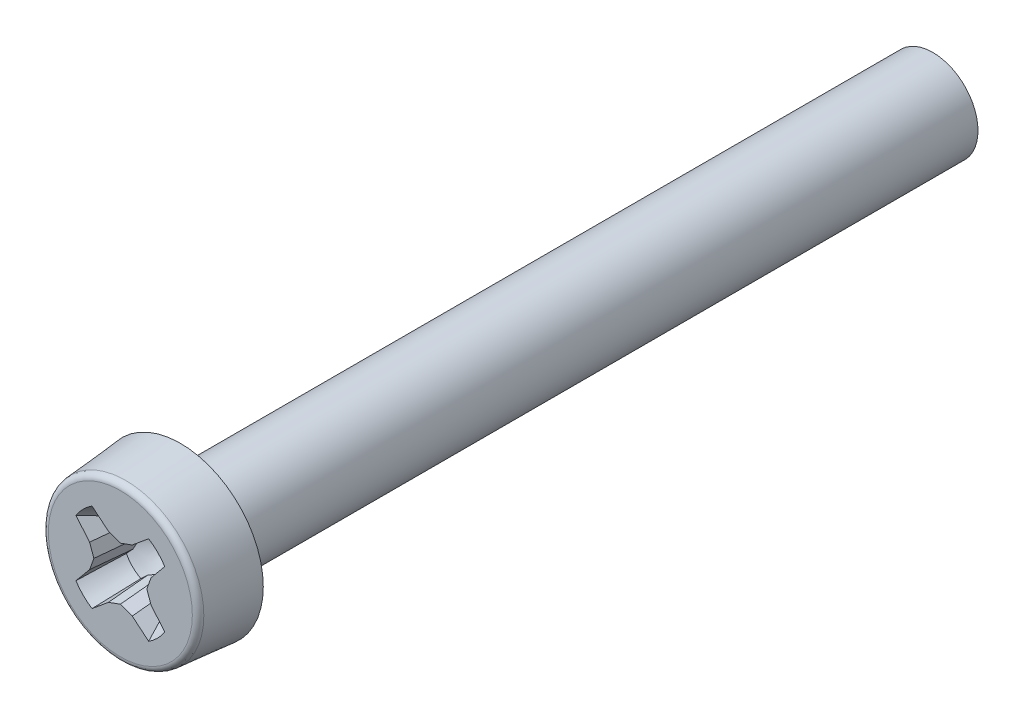
ISO-10303-21;
HEADER;
FILE_DESCRIPTION(('STEP AP214'),'2;1');
FILE_NAME('part.step','',(''),(''),'','','');
FILE_SCHEMA(('AUTOMOTIVE_DESIGN { 1 0 10303 214 1 1 1 1 }'));
ENDSEC;
DATA;
#1=APPLICATION_CONTEXT('core data for automotive mechanical design processes');
#2=APPLICATION_PROTOCOL_DEFINITION('international standard','automotive_design',2000,#1);
#3=PRODUCT_CONTEXT('',#1,'mechanical');
#4=PRODUCT('Part','Part','',(#3));
#5=PRODUCT_RELATED_PRODUCT_CATEGORY('part','',(#4));
#6=PRODUCT_DEFINITION_FORMATION('','',#4);
#7=PRODUCT_DEFINITION_CONTEXT('part definition',#1,'design');
#8=PRODUCT_DEFINITION('design','',#6,#7);
#9=PRODUCT_DEFINITION_SHAPE('','',#8);
#10=(LENGTH_UNIT() NAMED_UNIT(*) SI_UNIT(.MILLI.,.METRE.));
#11=(NAMED_UNIT(*) PLANE_ANGLE_UNIT() SI_UNIT($,.RADIAN.));
#12=(NAMED_UNIT(*) SI_UNIT($,.STERADIAN.) SOLID_ANGLE_UNIT());
#13=UNCERTAINTY_MEASURE_WITH_UNIT(LENGTH_MEASURE(1.E-05),#10,'distance_accuracy_value','');
#14=(GEOMETRIC_REPRESENTATION_CONTEXT(3) GLOBAL_UNCERTAINTY_ASSIGNED_CONTEXT((#13)) GLOBAL_UNIT_ASSIGNED_CONTEXT((#10,
#11,#12)) REPRESENTATION_CONTEXT('',''));
#15=CARTESIAN_POINT('',(0.,0.,0.));
#16=DIRECTION('',(0.,0.,1.));
#17=DIRECTION('',(1.,0.,0.));
#18=AXIS2_PLACEMENT_3D('',#15,#16,#17);
#19=CARTESIAN_POINT('',(0.,0.,-25.));
#20=DIRECTION('',(0.,0.,1.));
#21=DIRECTION('',(1.,0.,0.));
#22=AXIS2_PLACEMENT_3D('',#19,#20,#21);
#23=PLANE('',#22);
#24=CARTESIAN_POINT('',(0.,0.,-25.));
#25=DIRECTION('',(0.,0.,1.));
#26=DIRECTION('',(1.,0.,0.));
#27=AXIS2_PLACEMENT_3D('',#24,#25,#26);
#28=CIRCLE('',#27,1.5);
#29=CARTESIAN_POINT('',(1.5,0.,-25.));
#30=VERTEX_POINT('',#29);
#31=EDGE_CURVE('E11',#30,#30,#28,.T.);
#32=ORIENTED_EDGE('',*,*,#31,.F.);
#33=EDGE_LOOP('',(#32));
#34=FACE_BOUND('',#33,.T.);
#35=ADVANCED_FACE('F16',(#34),#23,.F.);
#36=CARTESIAN_POINT('',(0.,0.,-0.1));
#37=DIRECTION('',(0.,0.,-1.));
#38=DIRECTION('',(1.,0.,0.));
#39=AXIS2_PLACEMENT_3D('',#36,#37,#38);
#40=CYLINDRICAL_SURFACE('',#39,1.5);
#41=DIRECTION('',(0.,0.,-1.));
#42=VECTOR('',#41,1.);
#43=CARTESIAN_POINT('',(1.5,0.,-0.1));
#44=LINE('',#43,#42);
#45=CARTESIAN_POINT('',(1.5,0.,-0.1));
#46=VERTEX_POINT('',#45);
#47=EDGE_CURVE('E29',#46,#30,#44,.T.);
#48=ORIENTED_EDGE('',*,*,#47,.T.);
#49=ORIENTED_EDGE('',*,*,#31,.T.);
#50=ORIENTED_EDGE('',*,*,#47,.F.);
#51=CARTESIAN_POINT('',(0.,0.,-0.1));
#52=DIRECTION('',(0.,0.,1.));
#53=DIRECTION('',(1.,0.,0.));
#54=AXIS2_PLACEMENT_3D('',#51,#52,#53);
#55=CIRCLE('',#54,1.5);
#56=EDGE_CURVE('E468',#46,#46,#55,.T.);
#57=ORIENTED_EDGE('',*,*,#56,.F.);
#58=EDGE_LOOP('',(#48,#49,#50,#57));
#59=FACE_BOUND('',#58,.T.);
#60=ADVANCED_FACE('F568',(#59),#40,.T.);
#61=CARTESIAN_POINT('',(1.6,0.,0.));
#62=CARTESIAN_POINT('',(1.54142135623731,0.,0.));
#63=CARTESIAN_POINT('',(1.5,0.,-0.0414213562373095));
#64=CARTESIAN_POINT('',(1.5,0.,-0.1));
#65=(BOUNDED_CURVE() B_SPLINE_CURVE(3,(#61,#62,#63,#64),.UNSPECIFIED.,.F.,
.F.) B_SPLINE_CURVE_WITH_KNOTS((4,4),(0.,1.),
.UNSPECIFIED.) CURVE() GEOMETRIC_REPRESENTATION_ITEM() RATIONAL_B_SPLINE_CURVE((1.,
0.804737854124365,0.804737854124365,1.)) REPRESENTATION_ITEM(''));
#66=CARTESIAN_POINT('',(0.,0.,0.));
#67=DIRECTION('',(0.,0.,-1.));
#68=AXIS1_PLACEMENT('',#66,#67);
#69=SURFACE_OF_REVOLUTION('',#65,#68);
#70=CARTESIAN_POINT('',(1.6,0.,-0.1));
#71=DIRECTION('',(0.,-1.,0.));
#72=DIRECTION('',(0.,0.,1.));
#73=AXIS2_PLACEMENT_3D('',#70,#71,#72);
#74=CIRCLE('',#73,0.1);
#75=CARTESIAN_POINT('',(1.6,0.,0.));
#76=VERTEX_POINT('',#75);
#77=EDGE_CURVE('E472',#76,#46,#74,.T.);
#78=ORIENTED_EDGE('',*,*,#77,.T.);
#79=ORIENTED_EDGE('',*,*,#56,.T.);
#80=ORIENTED_EDGE('',*,*,#77,.F.);
#81=CARTESIAN_POINT('',(0.,0.,0.));
#82=DIRECTION('',(0.,0.,1.));
#83=DIRECTION('',(1.,0.,0.));
#84=AXIS2_PLACEMENT_3D('',#81,#82,#83);
#85=CIRCLE('',#84,1.6);
#86=EDGE_CURVE('E838',#76,#76,#85,.T.);
#87=ORIENTED_EDGE('',*,*,#86,.F.);
#88=EDGE_LOOP('',(#78,#79,#80,#87));
#89=FACE_BOUND('',#88,.T.);
#90=ADVANCED_FACE('F564',(#89),#69,.T.);
#91=CARTESIAN_POINT('',(0.,0.,0.));
#92=DIRECTION('',(0.,0.,1.));
#93=DIRECTION('',(1.,0.,0.));
#94=AXIS2_PLACEMENT_3D('',#91,#92,#93);
#95=PLANE('',#94);
#96=ORIENTED_EDGE('',*,*,#86,.T.);
#97=EDGE_LOOP('',(#96));
#98=FACE_BOUND('',#97,.T.);
#99=CARTESIAN_POINT('',(0.,0.,0.));
#100=DIRECTION('',(0.,0.,1.));
#101=DIRECTION('',(1.,0.,0.));
#102=AXIS2_PLACEMENT_3D('',#99,#100,#101);
#103=CIRCLE('',#102,2.75);
#104=CARTESIAN_POINT('',(2.75,0.,0.));
#105=VERTEX_POINT('',#104);
#106=EDGE_CURVE('E413',#105,#105,#103,.T.);
#107=ORIENTED_EDGE('',*,*,#106,.F.);
#108=EDGE_LOOP('',(#107));
#109=FACE_BOUND('',#108,.T.);
#110=ADVANCED_FACE('F567',(#98,#109),#95,.F.);
#111=CARTESIAN_POINT('',(0.,0.,1.81743114855));
#112=DIRECTION('',(0.,0.,-1.));
#113=DIRECTION('',(1.,0.,0.));
#114=AXIS2_PLACEMENT_3D('',#111,#112,#113);
#115=CONICAL_SURFACE('',#114,2.591759345272,0.08684928479054);
#116=DIRECTION('',(0.0867401448538781,0.,-0.996230970844978));
#117=VECTOR('',#116,1.);
#118=CARTESIAN_POINT('',(2.591759345272,0.,1.81743114855));
#119=LINE('',#118,#117);
#120=CARTESIAN_POINT('',(2.591759345272,0.,1.81743114855));
#121=VERTEX_POINT('',#120);
#122=EDGE_CURVE('E406',#121,#105,#119,.T.);
#123=ORIENTED_EDGE('',*,*,#122,.T.);
#124=ORIENTED_EDGE('',*,*,#106,.T.);
#125=ORIENTED_EDGE('',*,*,#122,.F.);
#126=CARTESIAN_POINT('',(0.,0.,1.81743114855));
#127=DIRECTION('',(0.,0.,1.));
#128=DIRECTION('',(1.,0.,0.));
#129=AXIS2_PLACEMENT_3D('',#126,#127,#128);
#130=CIRCLE('',#129,2.591759345272);
#131=EDGE_CURVE('E361',#121,#121,#130,.T.);
#132=ORIENTED_EDGE('',*,*,#131,.F.);
#133=EDGE_LOOP('',(#123,#124,#125,#132));
#134=FACE_BOUND('',#133,.T.);
#135=ADVANCED_FACE('F602',(#134),#115,.T.);
#136=CARTESIAN_POINT('',(2.392520405653,0.,2.));
#137=CARTESIAN_POINT('',(2.50172635124258,0.,2.));
#138=CARTESIAN_POINT('',(2.58224141997077,0.,1.92622153254636));
#139=CARTESIAN_POINT('',(2.59175934527131,0.,1.81743114854994));
#140=(BOUNDED_CURVE() B_SPLINE_CURVE(3,(#136,#137,#138,#139),.UNSPECIFIED.,.F.,
.F.) B_SPLINE_CURVE_WITH_KNOTS((4,4),(0.,1.),
.UNSPECIFIED.) CURVE() GEOMETRIC_REPRESENTATION_ITEM() RATIONAL_B_SPLINE_CURVE((1.,
0.824851557873878,0.824851557873878,1.)) REPRESENTATION_ITEM(''));
#141=CARTESIAN_POINT('',(0.,0.,0.));
#142=DIRECTION('',(0.,0.,-1.));
#143=AXIS1_PLACEMENT('',#141,#142);
#144=SURFACE_OF_REVOLUTION('',#140,#143);
#145=CARTESIAN_POINT('',(2.392520405653,0.,1.8));
#146=DIRECTION('',(0.,1.,0.));
#147=DIRECTION('',(0.,0.,1.));
#148=AXIS2_PLACEMENT_3D('',#145,#146,#147);
#149=CIRCLE('',#148,0.2);
#150=CARTESIAN_POINT('',(2.392520405653,0.,2.));
#151=VERTEX_POINT('',#150);
#152=EDGE_CURVE('E143',#151,#121,#149,.T.);
#153=ORIENTED_EDGE('',*,*,#152,.T.);
#154=ORIENTED_EDGE('',*,*,#131,.T.);
#155=ORIENTED_EDGE('',*,*,#152,.F.);
#156=CARTESIAN_POINT('',(0.,0.,2.));
#157=DIRECTION('',(0.,0.,1.));
#158=DIRECTION('',(1.,0.,0.));
#159=AXIS2_PLACEMENT_3D('',#156,#157,#158);
#160=CIRCLE('',#159,2.392520405653);
#161=EDGE_CURVE('E484',#151,#151,#160,.T.);
#162=ORIENTED_EDGE('',*,*,#161,.F.);
#163=EDGE_LOOP('',(#153,#154,#155,#162));
#164=FACE_BOUND('',#163,.T.);
#165=ADVANCED_FACE('F18',(#164),#144,.T.);
#166=CARTESIAN_POINT('',(0.947023607927,0.1975,1.963875213625));
#167=DIRECTION('',(-0.936058801009871,0.338983327629953,0.094256165002017));
#168=DIRECTION('',(0.100188061612041,0.,0.994968518250915));
#169=AXIS2_PLACEMENT_3D('',#166,#167,#168);
#170=PLANE('',#169);
#171=CARTESIAN_POINT('',(0.734999999999596,-9.30616694816422E-13,0.56855685952255));
#172=CARTESIAN_POINT('',(0.79980153318715,0.169360524085245,0.603012445904495));
#173=CARTESIAN_POINT('',(0.890868365166978,0.394999999999386,0.695907050353568));
#174=(BOUNDED_CURVE() B_SPLINE_CURVE(2,(#171,#172,#173),.UNSPECIFIED.,.F.,
.F.) B_SPLINE_CURVE_WITH_KNOTS((3,3),(0.,1.),
.UNSPECIFIED.) CURVE() GEOMETRIC_REPRESENTATION_ITEM() RATIONAL_B_SPLINE_CURVE((1.,
1.03521369543437,1.)) REPRESENTATION_ITEM(''));
#175=CARTESIAN_POINT('',(0.735,0.,0.568556859522));
#176=VERTEX_POINT('',#175);
#177=CARTESIAN_POINT('',(0.890868365168,0.395,0.695907050353));
#178=VERTEX_POINT('',#177);
#179=EDGE_CURVE('E418',#176,#178,#174,.T.);
#180=ORIENTED_EDGE('',*,*,#179,.F.);
#181=DIRECTION('',(-0.100188061611992,0.,-0.99496851825092));
#182=VECTOR('',#181,1.);
#183=CARTESIAN_POINT('',(1.055354479088,0.,3.75));
#184=LINE('',#183,#182);
#185=CARTESIAN_POINT('',(0.879138745017,0.,2.));
#186=VERTEX_POINT('',#185);
#187=EDGE_CURVE('E247',#186,#176,#184,.T.);
#188=ORIENTED_EDGE('',*,*,#187,.F.);
#189=DIRECTION('',(0.340499237923964,0.940244792047901,0.));
#190=VECTOR('',#189,1.);
#191=CARTESIAN_POINT('',(0.863725539296,-0.04256158250679,2.));
#192=LINE('',#191,#190);
#193=CARTESIAN_POINT('',(1.022183620264,0.395,2.));
#194=VERTEX_POINT('',#193);
#195=EDGE_CURVE('E266',#186,#194,#192,.T.);
#196=ORIENTED_EDGE('',*,*,#195,.T.);
#197=DIRECTION('',(-0.100188061611992,0.,-0.99496851825092));
#198=VECTOR('',#197,1.);
#199=CARTESIAN_POINT('',(1.198399354335,0.395,3.75));
#200=LINE('',#199,#198);
#201=EDGE_CURVE('E362',#194,#178,#200,.T.);
#202=ORIENTED_EDGE('',*,*,#201,.T.);
#203=EDGE_LOOP('',(#180,#188,#196,#202));
#204=FACE_BOUND('',#203,.T.);
#205=ADVANCED_FACE('F641',(#204),#170,.T.);
#206=CARTESIAN_POINT('',(2.231021642134,1.854404484376,1.963875213625));
#207=DIRECTION('',(-0.766881371683238,0.637126278968198,0.077220893632314));
#208=DIRECTION('',(0.100188061612077,0.,0.994968518250911));
#209=AXIS2_PLACEMENT_3D('',#206,#207,#208);
#210=PLANE('',#209);
#211=ORIENTED_EDGE('',*,*,#201,.F.);
#212=DIRECTION('',(0.63903443020369,0.769178130873627,0.));
#213=VECTOR('',#212,1.);
#214=CARTESIAN_POINT('',(1.321889247435,0.755742713105,2.));
#215=LINE('',#214,#213);
#216=CARTESIAN_POINT('',(1.475615257504,0.940776068904,2.));
#217=VERTEX_POINT('',#216);
#218=EDGE_CURVE('E273',#194,#217,#215,.T.);
#219=ORIENTED_EDGE('',*,*,#218,.T.);
#220=CARTESIAN_POINT('',(1.01386992590352,0.53206463267813,0.786557726503453));
#221=CARTESIAN_POINT('',(1.19475352467598,0.692704437911324,1.25752379887743));
#222=CARTESIAN_POINT('',(1.47561525750289,0.940776068904322,2.00000000000102));
#223=(BOUNDED_CURVE() B_SPLINE_CURVE(2,(#220,#221,#222),.UNSPECIFIED.,.F.,
.F.) B_SPLINE_CURVE_WITH_KNOTS((3,3),(0.,1.),
.UNSPECIFIED.) CURVE() GEOMETRIC_REPRESENTATION_ITEM() RATIONAL_B_SPLINE_CURVE((1.,
1.02497922150491,1.)) REPRESENTATION_ITEM(''));
#224=CARTESIAN_POINT('',(1.013869925904,0.532064632678,0.786557726503));
#225=VERTEX_POINT('',#224);
#226=EDGE_CURVE('E374',#225,#217,#223,.T.);
#227=ORIENTED_EDGE('',*,*,#226,.F.);
#228=CARTESIAN_POINT('',(0.890868365167427,0.395000000000776,0.695907050352949));
#229=CARTESIAN_POINT('',(0.947308492793762,0.457964771378293,0.736911134212639));
#230=CARTESIAN_POINT('',(1.01386992590389,0.532064632678474,0.786557726502873));
#231=(BOUNDED_CURVE() B_SPLINE_CURVE(2,(#228,#229,#230),.UNSPECIFIED.,.F.,
.F.) B_SPLINE_CURVE_WITH_KNOTS((3,3),(0.,1.),
.UNSPECIFIED.) CURVE() GEOMETRIC_REPRESENTATION_ITEM() RATIONAL_B_SPLINE_CURVE((1.,
1.00391683537931,1.)) REPRESENTATION_ITEM(''));
#232=EDGE_CURVE('E451',#178,#225,#231,.T.);
#233=ORIENTED_EDGE('',*,*,#232,.F.);
#234=EDGE_LOOP('',(#211,#219,#227,#233));
#235=FACE_BOUND('',#234,.T.);
#236=ADVANCED_FACE('F593',(#235),#210,.T.);
#237=CARTESIAN_POINT('',(0.,0.,2.875));
#238=DIRECTION('',(0.,0.,1.));
#239=DIRECTION('',(1.,0.,0.));
#240=AXIS2_PLACEMENT_3D('',#237,#238,#239);
#241=CONICAL_SURFACE('',#240,2.186258907047,0.462512251778);
#242=CARTESIAN_POINT('',(0.,0.,0.786557726503));
#243=DIRECTION('',(0.,0.,1.));
#244=DIRECTION('',(1.,0.,0.));
#245=AXIS2_PLACEMENT_3D('',#242,#243,#244);
#246=CIRCLE('',#245,1.145);
#247=CARTESIAN_POINT('',(0.532064632678,1.013869925904,0.786557726503));
#248=VERTEX_POINT('',#247);
#249=EDGE_CURVE('E464',#225,#248,#246,.T.);
#250=ORIENTED_EDGE('',*,*,#249,.F.);
#251=ORIENTED_EDGE('',*,*,#226,.T.);
#252=CARTESIAN_POINT('',(0.,0.,2.));
#253=DIRECTION('',(0.,0.,-1.));
#254=DIRECTION('',(1.,0.,0.));
#255=AXIS2_PLACEMENT_3D('',#252,#253,#254);
#256=CIRCLE('',#255,1.75);
#257=CARTESIAN_POINT('',(0.940776068904,1.475615257504,2.));
#258=VERTEX_POINT('',#257);
#259=EDGE_CURVE('E344',#258,#217,#256,.T.);
#260=ORIENTED_EDGE('',*,*,#259,.F.);
#261=CARTESIAN_POINT('',(0.940776068953974,1.47561525755911,2.00000000014963));
#262=CARTESIAN_POINT('',(0.692704437933355,1.19475352470083,1.25752379894243));
#263=CARTESIAN_POINT('',(0.532064632687296,1.01386992591384,0.786557726530328));
#264=(BOUNDED_CURVE() B_SPLINE_CURVE(2,(#261,#262,#263),.UNSPECIFIED.,.F.,
.F.) B_SPLINE_CURVE_WITH_KNOTS((3,3),(0.,1.),
.UNSPECIFIED.) CURVE() GEOMETRIC_REPRESENTATION_ITEM() RATIONAL_B_SPLINE_CURVE((1.,
1.02497922150815,1.)) REPRESENTATION_ITEM(''));
#265=EDGE_CURVE('E378',#258,#248,#264,.T.);
#266=ORIENTED_EDGE('',*,*,#265,.T.);
#267=EDGE_LOOP('',(#250,#251,#260,#266));
#268=FACE_BOUND('',#267,.T.);
#269=ADVANCED_FACE('F589',(#268),#241,.F.);
#270=CARTESIAN_POINT('',(1.854404484376,2.231021642134,1.963875213625));
#271=DIRECTION('',(0.637126278968198,-0.766881371683238,0.077220893632314));
#272=DIRECTION('',(0.,-0.100188061612077,-0.994968518250911));
#273=AXIS2_PLACEMENT_3D('',#270,#271,#272);
#274=PLANE('',#273);
#275=DIRECTION('',(-0.769178130873627,-0.63903443020369,0.));
#276=VECTOR('',#275,1.);
#277=CARTESIAN_POINT('',(0.755742713105,1.321889247435,2.));
#278=LINE('',#277,#276);
#279=CARTESIAN_POINT('',(0.395,1.022183620264,2.));
#280=VERTEX_POINT('',#279);
#281=EDGE_CURVE('E348',#258,#280,#278,.T.);
#282=ORIENTED_EDGE('',*,*,#281,.T.);
#283=DIRECTION('',(0.,-0.100188061611992,-0.99496851825092));
#284=VECTOR('',#283,1.);
#285=CARTESIAN_POINT('',(0.395,1.198399354335,3.75));
#286=LINE('',#285,#284);
#287=CARTESIAN_POINT('',(0.395,0.890868365168,0.695907050353));
#288=VERTEX_POINT('',#287);
#289=EDGE_CURVE('E397',#280,#288,#286,.T.);
#290=ORIENTED_EDGE('',*,*,#289,.T.);
#291=CARTESIAN_POINT('',(0.532064632671514,1.01386992589764,0.78655772649821));
#292=CARTESIAN_POINT('',(0.457964771373067,0.947308492789073,0.736911134209192));
#293=CARTESIAN_POINT('',(0.394999999996869,0.890868365163925,0.695907050350404));
#294=(BOUNDED_CURVE() B_SPLINE_CURVE(2,(#291,#292,#293),.UNSPECIFIED.,.F.,
.F.) B_SPLINE_CURVE_WITH_KNOTS((3,3),(0.,1.),
.UNSPECIFIED.) CURVE() GEOMETRIC_REPRESENTATION_ITEM() RATIONAL_B_SPLINE_CURVE((1.,
1.00391683537685,1.)) REPRESENTATION_ITEM(''));
#295=EDGE_CURVE('E277',#248,#288,#294,.T.);
#296=ORIENTED_EDGE('',*,*,#295,.F.);
#297=ORIENTED_EDGE('',*,*,#265,.F.);
#298=EDGE_LOOP('',(#282,#290,#296,#297));
#299=FACE_BOUND('',#298,.T.);
#300=ADVANCED_FACE('F592',(#299),#274,.T.);
#301=CARTESIAN_POINT('',(0.1975,0.947023607927,1.963875213625));
#302=DIRECTION('',(0.338983327629953,-0.936058801009871,0.094256165002017));
#303=DIRECTION('',(0.,-0.100188061612041,-0.994968518250915));
#304=AXIS2_PLACEMENT_3D('',#301,#302,#303);
#305=PLANE('',#304);
#306=ORIENTED_EDGE('',*,*,#289,.F.);
#307=DIRECTION('',(-0.940244792047901,-0.340499237923964,0.));
#308=VECTOR('',#307,1.);
#309=CARTESIAN_POINT('',(-0.04256158250679,0.863725539296,2.));
#310=LINE('',#309,#308);
#311=CARTESIAN_POINT('',(0.,0.879138745017,2.));
#312=VERTEX_POINT('',#311);
#313=EDGE_CURVE('E473',#280,#312,#310,.T.);
#314=ORIENTED_EDGE('',*,*,#313,.T.);
#315=DIRECTION('',(0.,-0.100188061611992,-0.99496851825092));
#316=VECTOR('',#315,1.);
#317=CARTESIAN_POINT('',(0.,1.055354479088,3.75));
#318=LINE('',#317,#316);
#319=CARTESIAN_POINT('',(0.,0.735,0.568556859522));
#320=VERTEX_POINT('',#319);
#321=EDGE_CURVE('E311',#312,#320,#318,.T.);
#322=ORIENTED_EDGE('',*,*,#321,.T.);
#323=CARTESIAN_POINT('',(0.395000000005466,0.890868365169431,0.695907050356071));
#324=CARTESIAN_POINT('',(0.169360524089203,0.799801533188704,0.603012445905683));
#325=CARTESIAN_POINT('',(2.0108636977767E-12,0.735000000000722,0.568556859523148));
#326=(BOUNDED_CURVE() B_SPLINE_CURVE(2,(#323,#324,#325),.UNSPECIFIED.,.F.,
.F.) B_SPLINE_CURVE_WITH_KNOTS((3,3),(0.,1.),
.UNSPECIFIED.) CURVE() GEOMETRIC_REPRESENTATION_ITEM() RATIONAL_B_SPLINE_CURVE((1.,
1.03521369543474,1.)) REPRESENTATION_ITEM(''));
#327=EDGE_CURVE('E442',#288,#320,#326,.T.);
#328=ORIENTED_EDGE('',*,*,#327,.F.);
#329=EDGE_LOOP('',(#306,#314,#322,#328));
#330=FACE_BOUND('',#329,.T.);
#331=ADVANCED_FACE('F636',(#330),#305,.T.);
#332=CARTESIAN_POINT('',(-0.1975,0.947023607927,1.963875213625));
#333=DIRECTION('',(-0.338983327629953,-0.936058801009871,0.094256165002017));
#334=DIRECTION('',(-0.940244792048157,0.340499237923256,0.));
#335=AXIS2_PLACEMENT_3D('',#332,#333,#334);
#336=PLANE('',#335);
#337=CARTESIAN_POINT('',(9.30616694816422E-13,0.734999999999596,0.56855685952255));
#338=CARTESIAN_POINT('',(-0.169360524085245,0.79980153318715,0.603012445904495));
#339=CARTESIAN_POINT('',(-0.394999999999386,0.890868365166978,0.695907050353568));
#340=(BOUNDED_CURVE() B_SPLINE_CURVE(2,(#337,#338,#339),.UNSPECIFIED.,.F.,
.F.) B_SPLINE_CURVE_WITH_KNOTS((3,3),(0.,1.),
.UNSPECIFIED.) CURVE() GEOMETRIC_REPRESENTATION_ITEM() RATIONAL_B_SPLINE_CURVE((1.,
1.03521369543437,1.)) REPRESENTATION_ITEM(''));
#341=CARTESIAN_POINT('',(-0.395,0.890868365168,0.695907050353));
#342=VERTEX_POINT('',#341);
#343=EDGE_CURVE('E435',#320,#342,#340,.T.);
#344=ORIENTED_EDGE('',*,*,#343,.F.);
#345=ORIENTED_EDGE('',*,*,#321,.F.);
#346=DIRECTION('',(-0.940244792047901,0.340499237923964,0.));
#347=VECTOR('',#346,1.);
#348=CARTESIAN_POINT('',(0.04256158250679,0.863725539296,2.));
#349=LINE('',#348,#347);
#350=CARTESIAN_POINT('',(-0.395,1.022183620264,2.));
#351=VERTEX_POINT('',#350);
#352=EDGE_CURVE('E373',#312,#351,#349,.T.);
#353=ORIENTED_EDGE('',*,*,#352,.T.);
#354=DIRECTION('',(0.,-0.100188061611992,-0.99496851825092));
#355=VECTOR('',#354,1.);
#356=CARTESIAN_POINT('',(-0.395,1.198399354335,3.75));
#357=LINE('',#356,#355);
#358=EDGE_CURVE('E308',#351,#342,#357,.T.);
#359=ORIENTED_EDGE('',*,*,#358,.T.);
#360=EDGE_LOOP('',(#344,#345,#353,#359));
#361=FACE_BOUND('',#360,.T.);
#362=ADVANCED_FACE('F583',(#361),#336,.T.);
#363=CARTESIAN_POINT('',(-1.854404484376,2.231021642134,1.963875213625));
#364=DIRECTION('',(-0.637126278968198,-0.766881371683238,0.077220893632314));
#365=DIRECTION('',(-0.769178130873751,0.639034430203539,0.));
#366=AXIS2_PLACEMENT_3D('',#363,#364,#365);
#367=PLANE('',#366);
#368=ORIENTED_EDGE('',*,*,#358,.F.);
#369=DIRECTION('',(-0.769178130873627,0.63903443020369,0.));
#370=VECTOR('',#369,1.);
#371=CARTESIAN_POINT('',(-0.755742713105,1.321889247435,2.));
#372=LINE('',#371,#370);
#373=CARTESIAN_POINT('',(-0.940776068904,1.475615257504,2.));
#374=VERTEX_POINT('',#373);
#375=EDGE_CURVE('E369',#351,#374,#372,.T.);
#376=ORIENTED_EDGE('',*,*,#375,.T.);
#377=CARTESIAN_POINT('',(-0.53206463267813,1.01386992590352,0.786557726503453));
#378=CARTESIAN_POINT('',(-0.692704437911324,1.19475352467598,1.25752379887743));
#379=CARTESIAN_POINT('',(-0.940776068904322,1.47561525750289,2.00000000000102));
#380=(BOUNDED_CURVE() B_SPLINE_CURVE(2,(#377,#378,#379),.UNSPECIFIED.,.F.,
.F.) B_SPLINE_CURVE_WITH_KNOTS((3,3),(0.,1.),
.UNSPECIFIED.) CURVE() GEOMETRIC_REPRESENTATION_ITEM() RATIONAL_B_SPLINE_CURVE((1.,
1.02497922150491,1.)) REPRESENTATION_ITEM(''));
#381=CARTESIAN_POINT('',(-0.532064632678,1.013869925904,0.786557726503));
#382=VERTEX_POINT('',#381);
#383=EDGE_CURVE('E312',#382,#374,#380,.T.);
#384=ORIENTED_EDGE('',*,*,#383,.F.);
#385=CARTESIAN_POINT('',(-0.395000000000776,0.890868365167427,0.695907050352949));
#386=CARTESIAN_POINT('',(-0.457964771378293,0.947308492793763,0.736911134212639));
#387=CARTESIAN_POINT('',(-0.532064632678474,1.01386992590389,0.786557726502873));
#388=(BOUNDED_CURVE() B_SPLINE_CURVE(2,(#385,#386,#387),.UNSPECIFIED.,.F.,
.F.) B_SPLINE_CURVE_WITH_KNOTS((3,3),(0.,1.),
.UNSPECIFIED.) CURVE() GEOMETRIC_REPRESENTATION_ITEM() RATIONAL_B_SPLINE_CURVE((1.,
1.00391683537894,1.)) REPRESENTATION_ITEM(''));
#389=EDGE_CURVE('E441',#342,#382,#388,.T.);
#390=ORIENTED_EDGE('',*,*,#389,.F.);
#391=EDGE_LOOP('',(#368,#376,#384,#390));
#392=FACE_BOUND('',#391,.T.);
#393=ADVANCED_FACE('F579',(#392),#367,.T.);
#394=CARTESIAN_POINT('',(0.,0.,2.875));
#395=DIRECTION('',(0.,0.,1.));
#396=DIRECTION('',(1.,0.,0.));
#397=AXIS2_PLACEMENT_3D('',#394,#395,#396);
#398=CONICAL_SURFACE('',#397,2.186258907047,0.462512251778);
#399=CARTESIAN_POINT('',(0.,0.,0.786557726503));
#400=DIRECTION('',(0.,0.,1.));
#401=DIRECTION('',(1.,0.,0.));
#402=AXIS2_PLACEMENT_3D('',#399,#400,#401);
#403=CIRCLE('',#402,1.145);
#404=CARTESIAN_POINT('',(-1.013869925904,0.532064632678,0.786557726503));
#405=VERTEX_POINT('',#404);
#406=EDGE_CURVE('E807',#382,#405,#403,.T.);
#407=ORIENTED_EDGE('',*,*,#406,.F.);
#408=ORIENTED_EDGE('',*,*,#383,.T.);
#409=CARTESIAN_POINT('',(0.,0.,2.));
#410=DIRECTION('',(0.,0.,-1.));
#411=DIRECTION('',(1.,0.,0.));
#412=AXIS2_PLACEMENT_3D('',#409,#410,#411);
#413=CIRCLE('',#412,1.75);
#414=CARTESIAN_POINT('',(-1.475615257504,0.940776068904,2.));
#415=VERTEX_POINT('',#414);
#416=EDGE_CURVE('E301',#415,#374,#413,.T.);
#417=ORIENTED_EDGE('',*,*,#416,.F.);
#418=CARTESIAN_POINT('',(-1.47561525755911,0.940776068953974,2.00000000014963));
#419=CARTESIAN_POINT('',(-1.19475352470083,0.692704437933355,1.25752379894243));
#420=CARTESIAN_POINT('',(-1.01386992591384,0.532064632687296,0.786557726530328));
#421=(BOUNDED_CURVE() B_SPLINE_CURVE(2,(#418,#419,#420),.UNSPECIFIED.,.F.,
.F.) B_SPLINE_CURVE_WITH_KNOTS((3,3),(0.,1.),
.UNSPECIFIED.) CURVE() GEOMETRIC_REPRESENTATION_ITEM() RATIONAL_B_SPLINE_CURVE((1.,
1.02497922150815,1.)) REPRESENTATION_ITEM(''));
#422=EDGE_CURVE('E385',#415,#405,#421,.T.);
#423=ORIENTED_EDGE('',*,*,#422,.T.);
#424=EDGE_LOOP('',(#407,#408,#417,#423));
#425=FACE_BOUND('',#424,.T.);
#426=ADVANCED_FACE('F582',(#425),#398,.F.);
#427=CARTESIAN_POINT('',(-2.231021642134,1.854404484376,1.963875213625));
#428=DIRECTION('',(0.766881371683238,0.637126278968198,0.077220893632314));
#429=DIRECTION('',(0.,0.12032133382455,-0.992734998187674));
#430=AXIS2_PLACEMENT_3D('',#427,#428,#429);
#431=PLANE('',#430);
#432=DIRECTION('',(0.63903443020369,-0.769178130873627,0.));
#433=VECTOR('',#432,1.);
#434=CARTESIAN_POINT('',(-1.321889247435,0.755742713105,2.));
#435=LINE('',#434,#433);
#436=CARTESIAN_POINT('',(-1.022183620264,0.395,2.));
#437=VERTEX_POINT('',#436);
#438=EDGE_CURVE('E297',#415,#437,#435,.T.);
#439=ORIENTED_EDGE('',*,*,#438,.T.);
#440=DIRECTION('',(0.100188061611992,0.,-0.99496851825092));
#441=VECTOR('',#440,1.);
#442=CARTESIAN_POINT('',(-1.198399354335,0.395,3.75));
#443=LINE('',#442,#441);
#444=CARTESIAN_POINT('',(-0.890868365168,0.395,0.695907050353));
#445=VERTEX_POINT('',#444);
#446=EDGE_CURVE('E365',#437,#445,#443,.T.);
#447=ORIENTED_EDGE('',*,*,#446,.T.);
#448=CARTESIAN_POINT('',(-1.01386992589764,0.532064632671514,0.78655772649821));
#449=CARTESIAN_POINT('',(-0.947308492789072,0.457964771373067,0.736911134209191));
#450=CARTESIAN_POINT('',(-0.890868365163925,0.394999999996869,0.695907050350404));
#451=(BOUNDED_CURVE() B_SPLINE_CURVE(2,(#448,#449,#450),.UNSPECIFIED.,.F.,
.F.) B_SPLINE_CURVE_WITH_KNOTS((3,3),(0.,1.),
.UNSPECIFIED.) CURVE() GEOMETRIC_REPRESENTATION_ITEM() RATIONAL_B_SPLINE_CURVE((1.,
1.00391683537771,1.)) REPRESENTATION_ITEM(''));
#452=EDGE_CURVE('E799',#405,#445,#451,.T.);
#453=ORIENTED_EDGE('',*,*,#452,.F.);
#454=ORIENTED_EDGE('',*,*,#422,.F.);
#455=EDGE_LOOP('',(#439,#447,#453,#454));
#456=FACE_BOUND('',#455,.T.);
#457=ADVANCED_FACE('F616',(#456),#431,.T.);
#458=CARTESIAN_POINT('',(-0.947023607927,0.1975,1.963875213625));
#459=DIRECTION('',(0.936058801009871,0.338983327629953,0.0942561650020169));
#460=DIRECTION('',(0.,0.267892223044291,-0.963448886465902));
#461=AXIS2_PLACEMENT_3D('',#458,#459,#460);
#462=PLANE('',#461);
#463=ORIENTED_EDGE('',*,*,#446,.F.);
#464=DIRECTION('',(0.340499237923964,-0.940244792047901,0.));
#465=VECTOR('',#464,1.);
#466=CARTESIAN_POINT('',(-0.863725539296,-0.04256158250679,2.));
#467=LINE('',#466,#465);
#468=CARTESIAN_POINT('',(-0.879138745017,0.,2.));
#469=VERTEX_POINT('',#468);
#470=EDGE_CURVE('E302',#437,#469,#467,.T.);
#471=ORIENTED_EDGE('',*,*,#470,.T.);
#472=DIRECTION('',(0.100188061611992,0.,-0.99496851825092));
#473=VECTOR('',#472,1.);
#474=CARTESIAN_POINT('',(-1.055354479088,0.,3.75));
#475=LINE('',#474,#473);
#476=CARTESIAN_POINT('',(-0.735,0.,0.568556859522));
#477=VERTEX_POINT('',#476);
#478=EDGE_CURVE('E295',#469,#477,#475,.T.);
#479=ORIENTED_EDGE('',*,*,#478,.T.);
#480=CARTESIAN_POINT('',(-0.890868365169431,0.395000000005466,0.695907050356071));
#481=CARTESIAN_POINT('',(-0.799801533188704,0.169360524089203,0.603012445905683));
#482=CARTESIAN_POINT('',(-0.735000000000722,2.0108636977767E-12,0.568556859523148));
#483=(BOUNDED_CURVE() B_SPLINE_CURVE(2,(#480,#481,#482),.UNSPECIFIED.,.F.,
.F.) B_SPLINE_CURVE_WITH_KNOTS((3,3),(0.,1.),
.UNSPECIFIED.) CURVE() GEOMETRIC_REPRESENTATION_ITEM() RATIONAL_B_SPLINE_CURVE((1.,
1.03521369543473,1.)) REPRESENTATION_ITEM(''));
#484=EDGE_CURVE('E288',#445,#477,#483,.T.);
#485=ORIENTED_EDGE('',*,*,#484,.F.);
#486=EDGE_LOOP('',(#463,#471,#479,#485));
#487=FACE_BOUND('',#486,.T.);
#488=ADVANCED_FACE('F610',(#487),#462,.T.);
#489=CARTESIAN_POINT('',(-0.947023607927,-0.1975,1.963875213625));
#490=DIRECTION('',(0.936058801009871,-0.338983327629953,0.0942561650020169));
#491=DIRECTION('',(0.,-0.267892223044291,-0.963448886465902));
#492=AXIS2_PLACEMENT_3D('',#489,#490,#491);
#493=PLANE('',#492);
#494=CARTESIAN_POINT('',(-0.734999999999596,9.30616694816422E-13,0.56855685952255));
#495=CARTESIAN_POINT('',(-0.79980153318715,-0.169360524085245,0.603012445904495));
#496=CARTESIAN_POINT('',(-0.890868365166978,-0.394999999999386,0.695907050353568));
#497=(BOUNDED_CURVE() B_SPLINE_CURVE(2,(#494,#495,#496),.UNSPECIFIED.,.F.,
.F.) B_SPLINE_CURVE_WITH_KNOTS((3,3),(0.,1.),
.UNSPECIFIED.) CURVE() GEOMETRIC_REPRESENTATION_ITEM() RATIONAL_B_SPLINE_CURVE((1.,
1.03521369543437,1.)) REPRESENTATION_ITEM(''));
#498=CARTESIAN_POINT('',(-0.890868365168,-0.395,0.695907050353));
#499=VERTEX_POINT('',#498);
#500=EDGE_CURVE('E281',#477,#499,#497,.T.);
#501=ORIENTED_EDGE('',*,*,#500,.F.);
#502=ORIENTED_EDGE('',*,*,#478,.F.);
#503=DIRECTION('',(-0.340499237923964,-0.940244792047901,0.));
#504=VECTOR('',#503,1.);
#505=CARTESIAN_POINT('',(-0.863725539296,0.04256158250679,2.));
#506=LINE('',#505,#504);
#507=CARTESIAN_POINT('',(-1.022183620264,-0.395,2.));
#508=VERTEX_POINT('',#507);
#509=EDGE_CURVE('E832',#469,#508,#506,.T.);
#510=ORIENTED_EDGE('',*,*,#509,.T.);
#511=DIRECTION('',(0.100188061611992,0.,-0.99496851825092));
#512=VECTOR('',#511,1.);
#513=CARTESIAN_POINT('',(-1.198399354335,-0.395,3.75));
#514=LINE('',#513,#512);
#515=EDGE_CURVE('E289',#508,#499,#514,.T.);
#516=ORIENTED_EDGE('',*,*,#515,.T.);
#517=EDGE_LOOP('',(#501,#502,#510,#516));
#518=FACE_BOUND('',#517,.T.);
#519=ADVANCED_FACE('F606',(#518),#493,.T.);
#520=CARTESIAN_POINT('',(-2.231021642134,-1.854404484376,1.963875213625));
#521=DIRECTION('',(0.766881371683238,-0.637126278968198,0.077220893632314));
#522=DIRECTION('',(0.,-0.12032133382455,-0.992734998187674));
#523=AXIS2_PLACEMENT_3D('',#520,#521,#522);
#524=PLANE('',#523);
#525=ORIENTED_EDGE('',*,*,#515,.F.);
#526=DIRECTION('',(-0.63903443020369,-0.769178130873627,0.));
#527=VECTOR('',#526,1.);
#528=CARTESIAN_POINT('',(-1.321889247435,-0.755742713105,2.));
#529=LINE('',#528,#527);
#530=CARTESIAN_POINT('',(-1.475615257504,-0.940776068904,2.));
#531=VERTEX_POINT('',#530);
#532=EDGE_CURVE('E833',#508,#531,#529,.T.);
#533=ORIENTED_EDGE('',*,*,#532,.T.);
#534=CARTESIAN_POINT('',(-1.01386992590352,-0.53206463267813,0.786557726503453));
#535=CARTESIAN_POINT('',(-1.19475352467598,-0.692704437911324,1.25752379887743));
#536=CARTESIAN_POINT('',(-1.47561525750289,-0.940776068904322,2.00000000000102));
#537=(BOUNDED_CURVE() B_SPLINE_CURVE(2,(#534,#535,#536),.UNSPECIFIED.,.F.,
.F.) B_SPLINE_CURVE_WITH_KNOTS((3,3),(0.,1.),
.UNSPECIFIED.) CURVE() GEOMETRIC_REPRESENTATION_ITEM() RATIONAL_B_SPLINE_CURVE((1.,
1.02497922150491,1.)) REPRESENTATION_ITEM(''));
#538=CARTESIAN_POINT('',(-1.013869925904,-0.532064632678,0.786557726503));
#539=VERTEX_POINT('',#538);
#540=EDGE_CURVE('E296',#539,#531,#537,.T.);
#541=ORIENTED_EDGE('',*,*,#540,.F.);
#542=CARTESIAN_POINT('',(-0.890868365167427,-0.395000000000776,0.695907050352949));
#543=CARTESIAN_POINT('',(-0.947308492793762,-0.457964771378293,0.736911134212639));
#544=CARTESIAN_POINT('',(-1.01386992590389,-0.532064632678474,0.786557726502873));
#545=(BOUNDED_CURVE() B_SPLINE_CURVE(2,(#542,#543,#544),.UNSPECIFIED.,.F.,
.F.) B_SPLINE_CURVE_WITH_KNOTS((3,3),(0.,1.),
.UNSPECIFIED.) CURVE() GEOMETRIC_REPRESENTATION_ITEM() RATIONAL_B_SPLINE_CURVE((1.,
1.00391683537931,1.)) REPRESENTATION_ITEM(''));
#546=EDGE_CURVE('E287',#499,#539,#545,.T.);
#547=ORIENTED_EDGE('',*,*,#546,.F.);
#548=EDGE_LOOP('',(#525,#533,#541,#547));
#549=FACE_BOUND('',#548,.T.);
#550=ADVANCED_FACE('F609',(#549),#524,.T.);
#551=CARTESIAN_POINT('',(0.,0.,2.875));
#552=DIRECTION('',(0.,0.,1.));
#553=DIRECTION('',(1.,0.,0.));
#554=AXIS2_PLACEMENT_3D('',#551,#552,#553);
#555=CONICAL_SURFACE('',#554,2.186258907047,0.462512251778);
#556=CARTESIAN_POINT('',(0.,0.,0.786557726503));
#557=DIRECTION('',(0.,0.,1.));
#558=DIRECTION('',(1.,0.,0.));
#559=AXIS2_PLACEMENT_3D('',#556,#557,#558);
#560=CIRCLE('',#559,1.145);
#561=CARTESIAN_POINT('',(-0.532064632678,-1.013869925904,0.786557726503));
#562=VERTEX_POINT('',#561);
#563=EDGE_CURVE('E303',#539,#562,#560,.T.);
#564=ORIENTED_EDGE('',*,*,#563,.F.);
#565=ORIENTED_EDGE('',*,*,#540,.T.);
#566=CARTESIAN_POINT('',(0.,0.,2.));
#567=DIRECTION('',(0.,0.,-1.));
#568=DIRECTION('',(1.,0.,0.));
#569=AXIS2_PLACEMENT_3D('',#566,#567,#568);
#570=CIRCLE('',#569,1.75);
#571=CARTESIAN_POINT('',(-0.940776068904,-1.475615257504,2.));
#572=VERTEX_POINT('',#571);
#573=EDGE_CURVE('E483',#572,#531,#570,.T.);
#574=ORIENTED_EDGE('',*,*,#573,.F.);
#575=CARTESIAN_POINT('',(-0.940776068953974,-1.47561525755911,2.00000000014963));
#576=CARTESIAN_POINT('',(-0.692704437933355,-1.19475352470083,1.25752379894243));
#577=CARTESIAN_POINT('',(-0.532064632687296,-1.01386992591384,0.786557726530328));
#578=(BOUNDED_CURVE() B_SPLINE_CURVE(2,(#575,#576,#577),.UNSPECIFIED.,.F.,
.F.) B_SPLINE_CURVE_WITH_KNOTS((3,3),(0.,1.),
.UNSPECIFIED.) CURVE() GEOMETRIC_REPRESENTATION_ITEM() RATIONAL_B_SPLINE_CURVE((1.,
1.02497922150815,1.)) REPRESENTATION_ITEM(''));
#579=EDGE_CURVE('E130',#572,#562,#578,.T.);
#580=ORIENTED_EDGE('',*,*,#579,.T.);
#581=EDGE_LOOP('',(#564,#565,#574,#580));
#582=FACE_BOUND('',#581,.T.);
#583=ADVANCED_FACE('F588',(#582),#555,.F.);
#584=CARTESIAN_POINT('',(-1.854404484376,-2.231021642134,1.963875213625));
#585=DIRECTION('',(-0.637126278968198,0.766881371683238,0.077220893632314));
#586=DIRECTION('',(0.12032133382455,0.,0.992734998187674));
#587=AXIS2_PLACEMENT_3D('',#584,#585,#586);
#588=PLANE('',#587);
#589=DIRECTION('',(0.769178130873627,0.63903443020369,0.));
#590=VECTOR('',#589,1.);
#591=CARTESIAN_POINT('',(-0.755742713105,-1.321889247435,2.));
#592=LINE('',#591,#590);
#593=CARTESIAN_POINT('',(-0.395,-1.022183620264,2.));
#594=VERTEX_POINT('',#593);
#595=EDGE_CURVE('E480',#572,#594,#592,.T.);
#596=ORIENTED_EDGE('',*,*,#595,.T.);
#597=DIRECTION('',(0.,0.100188061611992,-0.99496851825092));
#598=VECTOR('',#597,1.);
#599=CARTESIAN_POINT('',(-0.395,-1.198399354335,3.75));
#600=LINE('',#599,#598);
#601=CARTESIAN_POINT('',(-0.395,-0.890868365168,0.695907050353));
#602=VERTEX_POINT('',#601);
#603=EDGE_CURVE('E248',#594,#602,#600,.T.);
#604=ORIENTED_EDGE('',*,*,#603,.T.);
#605=CARTESIAN_POINT('',(-0.532064632671514,-1.01386992589764,0.78655772649821));
#606=CARTESIAN_POINT('',(-0.457964771373067,-0.947308492789073,0.736911134209192));
#607=CARTESIAN_POINT('',(-0.394999999996869,-0.890868365163925,0.695907050350404));
#608=(BOUNDED_CURVE() B_SPLINE_CURVE(2,(#605,#606,#607),.UNSPECIFIED.,.F.,
.F.) B_SPLINE_CURVE_WITH_KNOTS((3,3),(0.,1.),
.UNSPECIFIED.) CURVE() GEOMETRIC_REPRESENTATION_ITEM() RATIONAL_B_SPLINE_CURVE((1.,
1.00391683537685,1.)) REPRESENTATION_ITEM(''));
#609=EDGE_CURVE('E307',#562,#602,#608,.T.);
#610=ORIENTED_EDGE('',*,*,#609,.F.);
#611=ORIENTED_EDGE('',*,*,#579,.F.);
#612=EDGE_LOOP('',(#596,#604,#610,#611));
#613=FACE_BOUND('',#612,.T.);
#614=ADVANCED_FACE('F585',(#613),#588,.T.);
#615=CARTESIAN_POINT('',(0.,0.,2.875));
#616=DIRECTION('',(0.,0.,1.));
#617=DIRECTION('',(1.,0.,0.));
#618=AXIS2_PLACEMENT_3D('',#615,#616,#617);
#619=CONICAL_SURFACE('',#618,2.186258907047,0.462512251778);
#620=CARTESIAN_POINT('',(0.,0.,0.786557726503));
#621=DIRECTION('',(0.,0.,1.));
#622=DIRECTION('',(1.,0.,0.));
#623=AXIS2_PLACEMENT_3D('',#620,#621,#622);
#624=CIRCLE('',#623,1.145);
#625=CARTESIAN_POINT('',(0.532064632678,-1.013869925904,0.786557726503));
#626=VERTEX_POINT('',#625);
#627=CARTESIAN_POINT('',(1.013869925904,-0.532064632678,0.786557726503));
#628=VERTEX_POINT('',#627);
#629=EDGE_CURVE('E355',#626,#628,#624,.T.);
#630=ORIENTED_EDGE('',*,*,#629,.F.);
#631=CARTESIAN_POINT('',(0.53206463267813,-1.01386992590352,0.786557726503453));
#632=CARTESIAN_POINT('',(0.692704437911324,-1.19475352467598,1.25752379887743));
#633=CARTESIAN_POINT('',(0.940776068904322,-1.47561525750289,2.00000000000102));
#634=(BOUNDED_CURVE() B_SPLINE_CURVE(2,(#631,#632,#633),.UNSPECIFIED.,.F.,
.F.) B_SPLINE_CURVE_WITH_KNOTS((3,3),(0.,1.),
.UNSPECIFIED.) CURVE() GEOMETRIC_REPRESENTATION_ITEM() RATIONAL_B_SPLINE_CURVE((1.,
1.02497922150491,1.)) REPRESENTATION_ITEM(''));
#635=CARTESIAN_POINT('',(0.940776068904,-1.475615257504,2.));
#636=VERTEX_POINT('',#635);
#637=EDGE_CURVE('E330',#626,#636,#634,.T.);
#638=ORIENTED_EDGE('',*,*,#637,.T.);
#639=CARTESIAN_POINT('',(0.,0.,2.));
#640=DIRECTION('',(0.,0.,-1.));
#641=DIRECTION('',(1.,0.,0.));
#642=AXIS2_PLACEMENT_3D('',#639,#640,#641);
#643=CIRCLE('',#642,1.75);
#644=CARTESIAN_POINT('',(1.475615257504,-0.940776068904,2.));
#645=VERTEX_POINT('',#644);
#646=EDGE_CURVE('E259',#645,#636,#643,.T.);
#647=ORIENTED_EDGE('',*,*,#646,.F.);
#648=CARTESIAN_POINT('',(1.47561525755911,-0.940776068953974,2.00000000014963));
#649=CARTESIAN_POINT('',(1.19475352470083,-0.692704437933355,1.25752379894243));
#650=CARTESIAN_POINT('',(1.01386992591384,-0.532064632687296,0.786557726530328));
#651=(BOUNDED_CURVE() B_SPLINE_CURVE(2,(#648,#649,#650),.UNSPECIFIED.,.F.,
.F.) B_SPLINE_CURVE_WITH_KNOTS((3,3),(0.,1.),
.UNSPECIFIED.) CURVE() GEOMETRIC_REPRESENTATION_ITEM() RATIONAL_B_SPLINE_CURVE((1.,
1.02497922150815,1.)) REPRESENTATION_ITEM(''));
#652=EDGE_CURVE('E254',#645,#628,#651,.T.);
#653=ORIENTED_EDGE('',*,*,#652,.T.);
#654=EDGE_LOOP('',(#630,#638,#647,#653));
#655=FACE_BOUND('',#654,.T.);
#656=ADVANCED_FACE('F572',(#655),#619,.F.);
#657=CARTESIAN_POINT('',(2.231021642134,-1.854404484376,1.963875213625));
#658=DIRECTION('',(-0.766881371683238,-0.637126278968198,0.077220893632314));
#659=DIRECTION('',(-0.639034430203539,0.769178130873751,0.));
#660=AXIS2_PLACEMENT_3D('',#657,#658,#659);
#661=PLANE('',#660);
#662=DIRECTION('',(-0.63903443020369,0.769178130873627,0.));
#663=VECTOR('',#662,1.);
#664=CARTESIAN_POINT('',(1.321889247435,-0.755742713105,2.));
#665=LINE('',#664,#663);
#666=CARTESIAN_POINT('',(1.022183620264,-0.395,2.));
#667=VERTEX_POINT('',#666);
#668=EDGE_CURVE('E251',#645,#667,#665,.T.);
#669=ORIENTED_EDGE('',*,*,#668,.T.);
#670=DIRECTION('',(-0.100188061611992,0.,-0.99496851825092));
#671=VECTOR('',#670,1.);
#672=CARTESIAN_POINT('',(1.198399354335,-0.395,3.75));
#673=LINE('',#672,#671);
#674=CARTESIAN_POINT('',(0.890868365168,-0.395,0.695907050353));
#675=VERTEX_POINT('',#674);
#676=EDGE_CURVE('E235',#667,#675,#673,.T.);
#677=ORIENTED_EDGE('',*,*,#676,.T.);
#678=CARTESIAN_POINT('',(1.01386992589764,-0.532064632671514,0.78655772649821));
#679=CARTESIAN_POINT('',(0.947308492789072,-0.457964771373067,0.736911134209191));
#680=CARTESIAN_POINT('',(0.890868365163925,-0.394999999996869,0.695907050350404));
#681=(BOUNDED_CURVE() B_SPLINE_CURVE(2,(#678,#679,#680),.UNSPECIFIED.,.F.,
.F.) B_SPLINE_CURVE_WITH_KNOTS((3,3),(0.,1.),
.UNSPECIFIED.) CURVE() GEOMETRIC_REPRESENTATION_ITEM() RATIONAL_B_SPLINE_CURVE((1.,
1.00391683537771,1.)) REPRESENTATION_ITEM(''));
#682=EDGE_CURVE('E335',#628,#675,#681,.T.);
#683=ORIENTED_EDGE('',*,*,#682,.F.);
#684=ORIENTED_EDGE('',*,*,#652,.F.);
#685=EDGE_LOOP('',(#669,#677,#683,#684));
#686=FACE_BOUND('',#685,.T.);
#687=ADVANCED_FACE('F252',(#686),#661,.T.);
#688=CARTESIAN_POINT('',(0.947023607927,-0.1975,1.963875213625));
#689=DIRECTION('',(-0.936058801009871,-0.338983327629953,0.094256165002017));
#690=DIRECTION('',(-0.340499237923256,0.940244792048157,0.));
#691=AXIS2_PLACEMENT_3D('',#688,#689,#690);
#692=PLANE('',#691);
#693=ORIENTED_EDGE('',*,*,#676,.F.);
#694=DIRECTION('',(-0.340499237923964,0.940244792047901,0.));
#695=VECTOR('',#694,1.);
#696=CARTESIAN_POINT('',(0.863725539296,0.04256158250679,2.));
#697=LINE('',#696,#695);
#698=EDGE_CURVE('E239',#667,#186,#697,.T.);
#699=ORIENTED_EDGE('',*,*,#698,.T.);
#700=ORIENTED_EDGE('',*,*,#187,.T.);
#701=CARTESIAN_POINT('',(0.890868365169431,-0.395000000005466,0.695907050356071));
#702=CARTESIAN_POINT('',(0.799801533188704,-0.169360524089203,0.603012445905683));
#703=CARTESIAN_POINT('',(0.735000000000722,-2.0108636977767E-12,0.568556859523148));
#704=(BOUNDED_CURVE() B_SPLINE_CURVE(2,(#701,#702,#703),.UNSPECIFIED.,.F.,
.F.) B_SPLINE_CURVE_WITH_KNOTS((3,3),(0.,1.),
.UNSPECIFIED.) CURVE() GEOMETRIC_REPRESENTATION_ITEM() RATIONAL_B_SPLINE_CURVE((1.,
1.03521369543473,1.)) REPRESENTATION_ITEM(''));
#705=EDGE_CURVE('E242',#675,#176,#704,.T.);
#706=ORIENTED_EDGE('',*,*,#705,.F.);
#707=EDGE_LOOP('',(#693,#699,#700,#706));
#708=FACE_BOUND('',#707,.T.);
#709=ADVANCED_FACE('F237',(#708),#692,.T.);
#710=CARTESIAN_POINT('',(-0.1975,-0.947023607927,1.963875213625));
#711=DIRECTION('',(-0.338983327629953,0.936058801009871,0.0942561650020169));
#712=DIRECTION('',(0.267892223044291,0.,0.963448886465902));
#713=AXIS2_PLACEMENT_3D('',#710,#711,#712);
#714=PLANE('',#713);
#715=ORIENTED_EDGE('',*,*,#603,.F.);
#716=DIRECTION('',(0.940244792047901,0.340499237923964,0.));
#717=VECTOR('',#716,1.);
#718=CARTESIAN_POINT('',(0.04256158250679,-0.863725539296,2.));
#719=LINE('',#718,#717);
#720=CARTESIAN_POINT('',(0.,-0.879138745017,2.));
#721=VERTEX_POINT('',#720);
#722=EDGE_CURVE('E321',#594,#721,#719,.T.);
#723=ORIENTED_EDGE('',*,*,#722,.T.);
#724=DIRECTION('',(0.,0.100188061611992,-0.99496851825092));
#725=VECTOR('',#724,1.);
#726=CARTESIAN_POINT('',(0.,-1.055354479088,3.75));
#727=LINE('',#726,#725);
#728=CARTESIAN_POINT('',(0.,-0.735,0.568556859522));
#729=VERTEX_POINT('',#728);
#730=EDGE_CURVE('E343',#721,#729,#727,.T.);
#731=ORIENTED_EDGE('',*,*,#730,.T.);
#732=CARTESIAN_POINT('',(-0.395000000005466,-0.890868365169431,0.695907050356071));
#733=CARTESIAN_POINT('',(-0.169360524089203,-0.799801533188704,0.603012445905683));
#734=CARTESIAN_POINT('',(-2.0108636977767E-12,-0.735000000000722,0.568556859523148));
#735=(BOUNDED_CURVE() B_SPLINE_CURVE(2,(#732,#733,#734),.UNSPECIFIED.,.F.,
.F.) B_SPLINE_CURVE_WITH_KNOTS((3,3),(0.,1.),
.UNSPECIFIED.) CURVE() GEOMETRIC_REPRESENTATION_ITEM() RATIONAL_B_SPLINE_CURVE((1.,
1.03521369543474,1.)) REPRESENTATION_ITEM(''));
#736=EDGE_CURVE('E320',#602,#729,#735,.T.);
#737=ORIENTED_EDGE('',*,*,#736,.F.);
#738=EDGE_LOOP('',(#715,#723,#731,#737));
#739=FACE_BOUND('',#738,.T.);
#740=ADVANCED_FACE('F598',(#739),#714,.T.);
#741=CARTESIAN_POINT('',(1.854404484376,-2.231021642134,1.963875213625));
#742=DIRECTION('',(0.637126278968198,0.766881371683238,0.077220893632314));
#743=DIRECTION('',(0.12032133382455,0.,-0.992734998187674));
#744=AXIS2_PLACEMENT_3D('',#741,#742,#743);
#745=PLANE('',#744);
#746=DIRECTION('',(0.,0.100188061611992,-0.99496851825092));
#747=VECTOR('',#746,1.);
#748=CARTESIAN_POINT('',(0.395,-1.198399354335,3.75));
#749=LINE('',#748,#747);
#750=CARTESIAN_POINT('',(0.395,-1.022183620264,2.));
#751=VERTEX_POINT('',#750);
#752=CARTESIAN_POINT('',(0.395,-0.890868365168,0.695907050353));
#753=VERTEX_POINT('',#752);
#754=EDGE_CURVE('E336',#751,#753,#749,.T.);
#755=ORIENTED_EDGE('',*,*,#754,.F.);
#756=DIRECTION('',(0.769178130873627,-0.63903443020369,0.));
#757=VECTOR('',#756,1.);
#758=CARTESIAN_POINT('',(0.755742713105,-1.321889247435,2.));
#759=LINE('',#758,#757);
#760=EDGE_CURVE('E434',#751,#636,#759,.T.);
#761=ORIENTED_EDGE('',*,*,#760,.T.);
#762=ORIENTED_EDGE('',*,*,#637,.F.);
#763=CARTESIAN_POINT('',(0.395000000000776,-0.890868365167427,0.695907050352949));
#764=CARTESIAN_POINT('',(0.457964771378293,-0.947308492793763,0.736911134212639));
#765=CARTESIAN_POINT('',(0.532064632678474,-1.01386992590389,0.786557726502873));
#766=(BOUNDED_CURVE() B_SPLINE_CURVE(2,(#763,#764,#765),.UNSPECIFIED.,.F.,
.F.) B_SPLINE_CURVE_WITH_KNOTS((3,3),(0.,1.),
.UNSPECIFIED.) CURVE() GEOMETRIC_REPRESENTATION_ITEM() RATIONAL_B_SPLINE_CURVE((1.,
1.00391683537894,1.)) REPRESENTATION_ITEM(''));
#767=EDGE_CURVE('E349',#753,#626,#766,.T.);
#768=ORIENTED_EDGE('',*,*,#767,.F.);
#769=EDGE_LOOP('',(#755,#761,#762,#768));
#770=FACE_BOUND('',#769,.T.);
#771=ADVANCED_FACE('F577',(#770),#745,.T.);
#772=CARTESIAN_POINT('',(0.,0.,0.786557726503));
#773=DIRECTION('',(0.,0.,1.));
#774=DIRECTION('',(1.,0.,0.));
#775=AXIS2_PLACEMENT_3D('',#772,#773,#774);
#776=CONICAL_SURFACE('',#775,1.145,1.082104136236);
#777=ORIENTED_EDGE('',*,*,#705,.T.);
#778=DIRECTION('',(-0.882947592858898,0.,-0.469471562785946));
#779=VECTOR('',#778,1.);
#780=CARTESIAN_POINT('',(1.145,0.,0.786557726503));
#781=LINE('',#780,#779);
#782=CARTESIAN_POINT('',(0.,0.,0.177750427251));
#783=VERTEX_POINT('',#782);
#784=EDGE_CURVE('E405',#176,#783,#781,.T.);
#785=ORIENTED_EDGE('',*,*,#784,.T.);
#786=ORIENTED_EDGE('',*,*,#784,.F.);
#787=ORIENTED_EDGE('',*,*,#179,.T.);
#788=ORIENTED_EDGE('',*,*,#232,.T.);
#789=ORIENTED_EDGE('',*,*,#249,.T.);
#790=ORIENTED_EDGE('',*,*,#295,.T.);
#791=ORIENTED_EDGE('',*,*,#327,.T.);
#792=ORIENTED_EDGE('',*,*,#343,.T.);
#793=ORIENTED_EDGE('',*,*,#389,.T.);
#794=ORIENTED_EDGE('',*,*,#406,.T.);
#795=ORIENTED_EDGE('',*,*,#452,.T.);
#796=ORIENTED_EDGE('',*,*,#484,.T.);
#797=ORIENTED_EDGE('',*,*,#500,.T.);
#798=ORIENTED_EDGE('',*,*,#546,.T.);
#799=ORIENTED_EDGE('',*,*,#563,.T.);
#800=ORIENTED_EDGE('',*,*,#609,.T.);
#801=ORIENTED_EDGE('',*,*,#736,.T.);
#802=CARTESIAN_POINT('',(-9.30616694816422E-13,-0.734999999999596,0.56855685952255));
#803=CARTESIAN_POINT('',(0.169360524085245,-0.79980153318715,0.603012445904495));
#804=CARTESIAN_POINT('',(0.394999999999386,-0.890868365166978,0.695907050353568));
#805=(BOUNDED_CURVE() B_SPLINE_CURVE(2,(#802,#803,#804),.UNSPECIFIED.,.F.,
.F.) B_SPLINE_CURVE_WITH_KNOTS((3,3),(0.,1.),
.UNSPECIFIED.) CURVE() GEOMETRIC_REPRESENTATION_ITEM() RATIONAL_B_SPLINE_CURVE((1.,
1.03521369543437,1.)) REPRESENTATION_ITEM(''));
#806=EDGE_CURVE('E328',#729,#753,#805,.T.);
#807=ORIENTED_EDGE('',*,*,#806,.T.);
#808=ORIENTED_EDGE('',*,*,#767,.T.);
#809=ORIENTED_EDGE('',*,*,#629,.T.);
#810=ORIENTED_EDGE('',*,*,#682,.T.);
#811=EDGE_LOOP('',(#777,#785,#786,#787,#788,#789,#790,#791,#792,#793,#794,#795,#796,#797,#798,
#799,#800,#801,#807,#808,#809,#810));
#812=FACE_BOUND('',#811,.T.);
#813=ADVANCED_FACE('F573',(#812),#776,.F.);
#814=CARTESIAN_POINT('',(0.1975,-0.947023607927,1.963875213625));
#815=DIRECTION('',(0.338983327629953,0.936058801009871,0.0942561650020169));
#816=DIRECTION('',(0.267892223044291,0.,-0.963448886465902));
#817=AXIS2_PLACEMENT_3D('',#814,#815,#816);
#818=PLANE('',#817);
#819=ORIENTED_EDGE('',*,*,#806,.F.);
#820=ORIENTED_EDGE('',*,*,#730,.F.);
#821=DIRECTION('',(0.940244792047901,-0.340499237923964,0.));
#822=VECTOR('',#821,1.);
#823=CARTESIAN_POINT('',(-0.04256158250679,-0.863725539296,2.));
#824=LINE('',#823,#822);
#825=EDGE_CURVE('E329',#721,#751,#824,.T.);
#826=ORIENTED_EDGE('',*,*,#825,.T.);
#827=ORIENTED_EDGE('',*,*,#754,.T.);
#828=EDGE_LOOP('',(#819,#820,#826,#827));
#829=FACE_BOUND('',#828,.T.);
#830=ADVANCED_FACE('F576',(#829),#818,.T.);
#831=CARTESIAN_POINT('',(0.,0.,2.));
#832=DIRECTION('',(0.,0.,1.));
#833=DIRECTION('',(1.,0.,0.));
#834=AXIS2_PLACEMENT_3D('',#831,#832,#833);
#835=PLANE('',#834);
#836=ORIENTED_EDGE('',*,*,#595,.F.);
#837=ORIENTED_EDGE('',*,*,#573,.T.);
#838=ORIENTED_EDGE('',*,*,#532,.F.);
#839=ORIENTED_EDGE('',*,*,#509,.F.);
#840=ORIENTED_EDGE('',*,*,#470,.F.);
#841=ORIENTED_EDGE('',*,*,#438,.F.);
#842=ORIENTED_EDGE('',*,*,#416,.T.);
#843=ORIENTED_EDGE('',*,*,#375,.F.);
#844=ORIENTED_EDGE('',*,*,#352,.F.);
#845=ORIENTED_EDGE('',*,*,#313,.F.);
#846=ORIENTED_EDGE('',*,*,#281,.F.);
#847=ORIENTED_EDGE('',*,*,#259,.T.);
#848=ORIENTED_EDGE('',*,*,#218,.F.);
#849=ORIENTED_EDGE('',*,*,#195,.F.);
#850=ORIENTED_EDGE('',*,*,#698,.F.);
#851=ORIENTED_EDGE('',*,*,#668,.F.);
#852=ORIENTED_EDGE('',*,*,#646,.T.);
#853=ORIENTED_EDGE('',*,*,#760,.F.);
#854=ORIENTED_EDGE('',*,*,#825,.F.);
#855=ORIENTED_EDGE('',*,*,#722,.F.);
#856=EDGE_LOOP('',(#836,#837,#838,#839,#840,#841,#842,#843,#844,#845,#846,#847,#848,#849,#850,
#851,#852,#853,#854,#855));
#857=FACE_BOUND('',#856,.T.);
#858=ORIENTED_EDGE('',*,*,#161,.T.);
#859=EDGE_LOOP('',(#858));
#860=FACE_BOUND('',#859,.T.);
#861=ADVANCED_FACE('F262',(#857,#860),#835,.T.);
#862=CLOSED_SHELL('',(#35,#60,#90,#110,#135,#165,#205,#236,#269,#300,#331,#362,#393,#426,#457,
#488,#519,#550,#583,#614,#656,#687,#709,#740,#771,#813,#830,#861));
#863=MANIFOLD_SOLID_BREP('B1',#862);
#864=ADVANCED_BREP_SHAPE_REPRESENTATION('',(#18,#863),#14);
#865=SHAPE_DEFINITION_REPRESENTATION(#9,#864);
ENDSEC;
END-ISO-10303-21;
